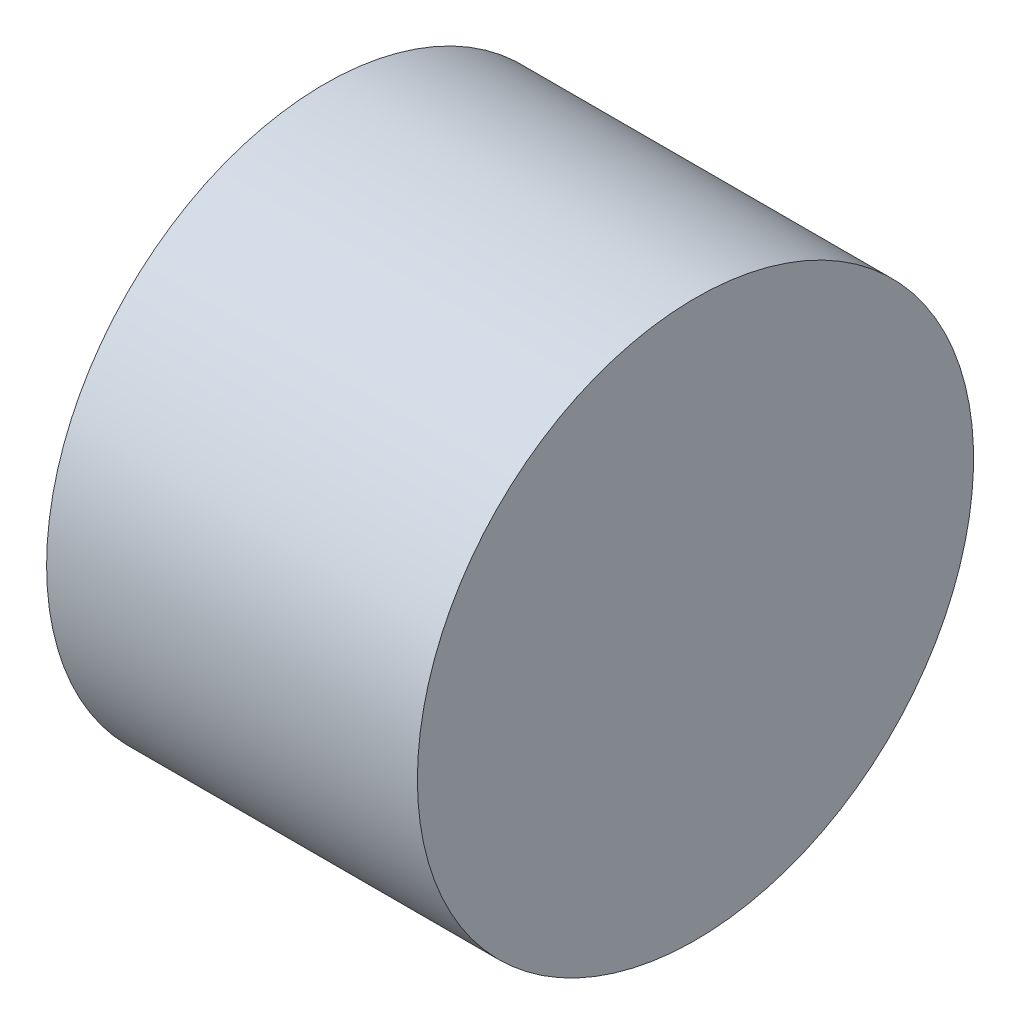
ISO-10303-21;
HEADER;
FILE_DESCRIPTION(('STEP AP214'),'2;1');
FILE_NAME('part.step','',(''),(''),'','','');
FILE_SCHEMA(('AUTOMOTIVE_DESIGN { 1 0 10303 214 1 1 1 1 }'));
ENDSEC;
DATA;
#1=APPLICATION_CONTEXT('core data for automotive mechanical design processes');
#2=APPLICATION_PROTOCOL_DEFINITION('international standard','automotive_design',2000,#1);
#3=PRODUCT_CONTEXT('',#1,'mechanical');
#4=PRODUCT('Part','Part','',(#3));
#5=PRODUCT_RELATED_PRODUCT_CATEGORY('part','',(#4));
#6=PRODUCT_DEFINITION_FORMATION('','',#4);
#7=PRODUCT_DEFINITION_CONTEXT('part definition',#1,'design');
#8=PRODUCT_DEFINITION('design','',#6,#7);
#9=PRODUCT_DEFINITION_SHAPE('','',#8);
#10=(LENGTH_UNIT() NAMED_UNIT(*) SI_UNIT(.MILLI.,.METRE.));
#11=(NAMED_UNIT(*) PLANE_ANGLE_UNIT() SI_UNIT($,.RADIAN.));
#12=(NAMED_UNIT(*) SI_UNIT($,.STERADIAN.) SOLID_ANGLE_UNIT());
#13=UNCERTAINTY_MEASURE_WITH_UNIT(LENGTH_MEASURE(1.E-05),#10,'distance_accuracy_value','');
#14=(GEOMETRIC_REPRESENTATION_CONTEXT(3) GLOBAL_UNCERTAINTY_ASSIGNED_CONTEXT((#13)) GLOBAL_UNIT_ASSIGNED_CONTEXT((#10,
#11,#12)) REPRESENTATION_CONTEXT('',''));
#15=CARTESIAN_POINT('',(0.,0.,0.));
#16=DIRECTION('',(0.,0.,1.));
#17=DIRECTION('',(1.,0.,0.));
#18=AXIS2_PLACEMENT_3D('',#15,#16,#17);
#19=CARTESIAN_POINT('',(0.,0.,0.));
#20=DIRECTION('',(1.,0.,0.));
#21=DIRECTION('',(0.,0.,-1.));
#22=AXIS2_PLACEMENT_3D('',#19,#20,#21);
#23=PLANE('',#22);
#24=CARTESIAN_POINT('',(0.,0.,0.));
#25=DIRECTION('',(-1.,0.,0.));
#26=DIRECTION('',(0.,0.,1.));
#27=AXIS2_PLACEMENT_3D('',#24,#25,#26);
#28=CIRCLE('',#27,6.);
#29=CARTESIAN_POINT('',(0.,0.,6.));
#30=VERTEX_POINT('',#29);
#31=EDGE_CURVE('E12',#30,#30,#28,.T.);
#32=ORIENTED_EDGE('',*,*,#31,.T.);
#33=EDGE_LOOP('',(#32));
#34=FACE_BOUND('',#33,.T.);
#35=ADVANCED_FACE('F45',(#34),#23,.F.);
#36=CARTESIAN_POINT('',(0.,0.,0.));
#37=DIRECTION('',(-1.,0.,0.));
#38=DIRECTION('',(0.,0.,1.));
#39=AXIS2_PLACEMENT_3D('',#36,#37,#38);
#40=CYLINDRICAL_SURFACE('',#39,6.);
#41=ORIENTED_EDGE('',*,*,#31,.F.);
#42=EDGE_LOOP('',(#41));
#43=FACE_BOUND('',#42,.T.);
#44=CARTESIAN_POINT('',(8.,0.,0.));
#45=DIRECTION('',(-1.,0.,0.));
#46=DIRECTION('',(0.,0.,1.));
#47=AXIS2_PLACEMENT_3D('',#44,#45,#46);
#48=CIRCLE('',#47,6.);
#49=CARTESIAN_POINT('',(8.,0.,6.));
#50=VERTEX_POINT('',#49);
#51=EDGE_CURVE('E51',#50,#50,#48,.T.);
#52=ORIENTED_EDGE('',*,*,#51,.T.);
#53=EDGE_LOOP('',(#52));
#54=FACE_BOUND('',#53,.T.);
#55=ADVANCED_FACE('F57',(#43,#54),#40,.T.);
#56=CARTESIAN_POINT('',(8.,0.,0.));
#57=DIRECTION('',(-1.,0.,0.));
#58=DIRECTION('',(0.,0.,1.));
#59=AXIS2_PLACEMENT_3D('',#56,#57,#58);
#60=PLANE('',#59);
#61=ORIENTED_EDGE('',*,*,#51,.F.);
#62=EDGE_LOOP('',(#61));
#63=FACE_BOUND('',#62,.T.);
#64=ADVANCED_FACE('F59',(#63),#60,.F.);
#65=CLOSED_SHELL('',(#35,#55,#64));
#66=MANIFOLD_SOLID_BREP('B2',#65);
#67=ADVANCED_BREP_SHAPE_REPRESENTATION('',(#18,#66),#14);
#68=SHAPE_DEFINITION_REPRESENTATION(#9,#67);
ENDSEC;
END-ISO-10303-21;
